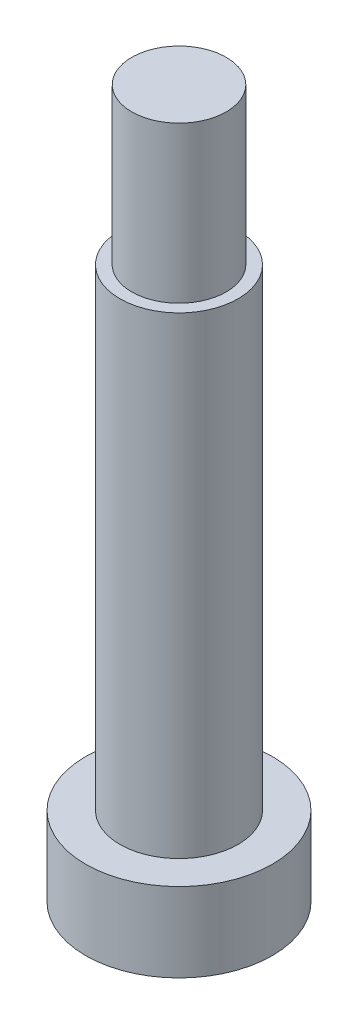
ISO-10303-21;
HEADER;
FILE_DESCRIPTION(('STEP AP214'),'2;1');
FILE_NAME('part.step','',(''),(''),'','','');
FILE_SCHEMA(('AUTOMOTIVE_DESIGN { 1 0 10303 214 1 1 1 1 }'));
ENDSEC;
DATA;
#1=APPLICATION_CONTEXT('core data for automotive mechanical design processes');
#2=APPLICATION_PROTOCOL_DEFINITION('international standard','automotive_design',2000,#1);
#3=PRODUCT_CONTEXT('',#1,'mechanical');
#4=PRODUCT('Part','Part','',(#3));
#5=PRODUCT_RELATED_PRODUCT_CATEGORY('part','',(#4));
#6=PRODUCT_DEFINITION_FORMATION('','',#4);
#7=PRODUCT_DEFINITION_CONTEXT('part definition',#1,'design');
#8=PRODUCT_DEFINITION('design','',#6,#7);
#9=PRODUCT_DEFINITION_SHAPE('','',#8);
#10=(LENGTH_UNIT() NAMED_UNIT(*) SI_UNIT(.MILLI.,.METRE.));
#11=(NAMED_UNIT(*) PLANE_ANGLE_UNIT() SI_UNIT($,.RADIAN.));
#12=(NAMED_UNIT(*) SI_UNIT($,.STERADIAN.) SOLID_ANGLE_UNIT());
#13=UNCERTAINTY_MEASURE_WITH_UNIT(LENGTH_MEASURE(1.E-05),#10,'distance_accuracy_value','');
#14=(GEOMETRIC_REPRESENTATION_CONTEXT(3) GLOBAL_UNCERTAINTY_ASSIGNED_CONTEXT((#13)) GLOBAL_UNIT_ASSIGNED_CONTEXT((#10,
#11,#12)) REPRESENTATION_CONTEXT('',''));
#15=CARTESIAN_POINT('',(0.,0.,0.));
#16=DIRECTION('',(0.,0.,1.));
#17=DIRECTION('',(1.,0.,0.));
#18=AXIS2_PLACEMENT_3D('',#15,#16,#17);
#19=CARTESIAN_POINT('',(0.,59.9,0.));
#20=DIRECTION('',(0.,-1.,0.));
#21=DIRECTION('',(0.,0.,-1.));
#22=AXIS2_PLACEMENT_3D('',#19,#20,#21);
#23=CYLINDRICAL_SURFACE('',#22,4.);
#24=CARTESIAN_POINT('',(0.,46.7,0.));
#25=DIRECTION('',(0.,1.,0.));
#26=DIRECTION('',(0.,0.,1.));
#27=AXIS2_PLACEMENT_3D('',#24,#25,#26);
#28=CIRCLE('',#27,4.);
#29=CARTESIAN_POINT('',(0.,46.7,4.));
#30=VERTEX_POINT('',#29);
#31=EDGE_CURVE('E189',#30,#30,#28,.T.);
#32=ORIENTED_EDGE('',*,*,#31,.T.);
#33=EDGE_LOOP('',(#32));
#34=FACE_BOUND('',#33,.T.);
#35=CARTESIAN_POINT('',(0.,59.9,0.));
#36=DIRECTION('',(0.,1.,0.));
#37=DIRECTION('',(0.,0.,1.));
#38=AXIS2_PLACEMENT_3D('',#35,#36,#37);
#39=CIRCLE('',#38,4.);
#40=CARTESIAN_POINT('',(0.,59.9,4.));
#41=VERTEX_POINT('',#40);
#42=EDGE_CURVE('E12',#41,#41,#39,.T.);
#43=ORIENTED_EDGE('',*,*,#42,.F.);
#44=EDGE_LOOP('',(#43));
#45=FACE_BOUND('',#44,.T.);
#46=ADVANCED_FACE('F73',(#34,#45),#23,.T.);
#47=CARTESIAN_POINT('',(0.,59.9,0.));
#48=DIRECTION('',(0.,1.,0.));
#49=DIRECTION('',(0.,0.,1.));
#50=AXIS2_PLACEMENT_3D('',#47,#48,#49);
#51=PLANE('',#50);
#52=ORIENTED_EDGE('',*,*,#42,.T.);
#53=EDGE_LOOP('',(#52));
#54=FACE_BOUND('',#53,.T.);
#55=ADVANCED_FACE('F197',(#54),#51,.T.);
#56=CARTESIAN_POINT('',(0.,46.7,0.));
#57=DIRECTION('',(0.,-1.,0.));
#58=DIRECTION('',(0.,0.,-1.));
#59=AXIS2_PLACEMENT_3D('',#56,#57,#58);
#60=CYLINDRICAL_SURFACE('',#59,5.);
#61=CARTESIAN_POINT('',(0.,6.7,0.));
#62=DIRECTION('',(0.,1.,0.));
#63=DIRECTION('',(0.,0.,1.));
#64=AXIS2_PLACEMENT_3D('',#61,#62,#63);
#65=CIRCLE('',#64,5.);
#66=CARTESIAN_POINT('',(0.,6.7,5.));
#67=VERTEX_POINT('',#66);
#68=EDGE_CURVE('E185',#67,#67,#65,.T.);
#69=ORIENTED_EDGE('',*,*,#68,.T.);
#70=EDGE_LOOP('',(#69));
#71=FACE_BOUND('',#70,.T.);
#72=CARTESIAN_POINT('',(0.,46.7,0.));
#73=DIRECTION('',(0.,1.,0.));
#74=DIRECTION('',(0.,0.,1.));
#75=AXIS2_PLACEMENT_3D('',#72,#73,#74);
#76=CIRCLE('',#75,5.);
#77=CARTESIAN_POINT('',(0.,46.7,5.));
#78=VERTEX_POINT('',#77);
#79=EDGE_CURVE('E81',#78,#78,#76,.T.);
#80=ORIENTED_EDGE('',*,*,#79,.F.);
#81=EDGE_LOOP('',(#80));
#82=FACE_BOUND('',#81,.T.);
#83=ADVANCED_FACE('F200',(#71,#82),#60,.T.);
#84=CARTESIAN_POINT('',(0.,46.7,0.));
#85=DIRECTION('',(0.,1.,0.));
#86=DIRECTION('',(0.,0.,1.));
#87=AXIS2_PLACEMENT_3D('',#84,#85,#86);
#88=PLANE('',#87);
#89=ORIENTED_EDGE('',*,*,#31,.F.);
#90=EDGE_LOOP('',(#89));
#91=FACE_BOUND('',#90,.T.);
#92=ORIENTED_EDGE('',*,*,#79,.T.);
#93=EDGE_LOOP('',(#92));
#94=FACE_BOUND('',#93,.T.);
#95=ADVANCED_FACE('F192',(#91,#94),#88,.T.);
#96=CARTESIAN_POINT('',(0.,6.7,0.));
#97=DIRECTION('',(0.,-1.,0.));
#98=DIRECTION('',(0.,0.,-1.));
#99=AXIS2_PLACEMENT_3D('',#96,#97,#98);
#100=CYLINDRICAL_SURFACE('',#99,7.9);
#101=CARTESIAN_POINT('',(0.,6.7,0.));
#102=DIRECTION('',(0.,1.,0.));
#103=DIRECTION('',(0.,0.,1.));
#104=AXIS2_PLACEMENT_3D('',#101,#102,#103);
#105=CIRCLE('',#104,7.9);
#106=CARTESIAN_POINT('',(0.,6.7,7.9));
#107=VERTEX_POINT('',#106);
#108=EDGE_CURVE('E184',#107,#107,#105,.T.);
#109=ORIENTED_EDGE('',*,*,#108,.F.);
#110=EDGE_LOOP('',(#109));
#111=FACE_BOUND('',#110,.T.);
#112=CARTESIAN_POINT('',(0.,0.,0.));
#113=DIRECTION('',(0.,1.,0.));
#114=DIRECTION('',(0.,0.,1.));
#115=AXIS2_PLACEMENT_3D('',#112,#113,#114);
#116=CIRCLE('',#115,7.9);
#117=CARTESIAN_POINT('',(0.,0.,7.9));
#118=VERTEX_POINT('',#117);
#119=EDGE_CURVE('E176',#118,#118,#116,.T.);
#120=ORIENTED_EDGE('',*,*,#119,.T.);
#121=EDGE_LOOP('',(#120));
#122=FACE_BOUND('',#121,.T.);
#123=ADVANCED_FACE('F207',(#111,#122),#100,.T.);
#124=CARTESIAN_POINT('',(0.,6.7,0.));
#125=DIRECTION('',(0.,1.,0.));
#126=DIRECTION('',(0.,0.,1.));
#127=AXIS2_PLACEMENT_3D('',#124,#125,#126);
#128=PLANE('',#127);
#129=ORIENTED_EDGE('',*,*,#68,.F.);
#130=EDGE_LOOP('',(#129));
#131=FACE_BOUND('',#130,.T.);
#132=ORIENTED_EDGE('',*,*,#108,.T.);
#133=EDGE_LOOP('',(#132));
#134=FACE_BOUND('',#133,.T.);
#135=ADVANCED_FACE('F243',(#131,#134),#128,.T.);
#136=CARTESIAN_POINT('',(0.,0.,0.));
#137=DIRECTION('',(0.,1.,0.));
#138=DIRECTION('',(0.,0.,1.));
#139=AXIS2_PLACEMENT_3D('',#136,#137,#138);
#140=PLANE('',#139);
#141=DIRECTION('',(-0.866025403784439,0.,0.5));
#142=VECTOR('',#141,1.);
#143=CARTESIAN_POINT('',(2.5,0.,1.44337567297406));
#144=LINE('',#143,#142);
#145=CARTESIAN_POINT('',(2.5,0.,1.44337567297406));
#146=VERTEX_POINT('',#145);
#147=CARTESIAN_POINT('',(0.,0.,2.88675134594813));
#148=VERTEX_POINT('',#147);
#149=EDGE_CURVE('E161',#146,#148,#144,.T.);
#150=ORIENTED_EDGE('',*,*,#149,.F.);
#151=DIRECTION('',(0.,0.,1.));
#152=VECTOR('',#151,1.);
#153=CARTESIAN_POINT('',(2.5,0.,-1.44337567297406));
#154=LINE('',#153,#152);
#155=CARTESIAN_POINT('',(2.5,0.,-1.44337567297406));
#156=VERTEX_POINT('',#155);
#157=EDGE_CURVE('E87',#156,#146,#154,.T.);
#158=ORIENTED_EDGE('',*,*,#157,.F.);
#159=DIRECTION('',(0.866025403784439,0.,0.5));
#160=VECTOR('',#159,1.);
#161=CARTESIAN_POINT('',(0.,0.,-2.88675134594813));
#162=LINE('',#161,#160);
#163=CARTESIAN_POINT('',(0.,0.,-2.88675134594813));
#164=VERTEX_POINT('',#163);
#165=EDGE_CURVE('E175',#164,#156,#162,.T.);
#166=ORIENTED_EDGE('',*,*,#165,.F.);
#167=DIRECTION('',(0.866025403784439,0.,-0.5));
#168=VECTOR('',#167,1.);
#169=CARTESIAN_POINT('',(-2.5,0.,-1.44337567297407));
#170=LINE('',#169,#168);
#171=CARTESIAN_POINT('',(-2.5,0.,-1.44337567297407));
#172=VERTEX_POINT('',#171);
#173=EDGE_CURVE('E167',#172,#164,#170,.T.);
#174=ORIENTED_EDGE('',*,*,#173,.F.);
#175=DIRECTION('',(0.,0.,-1.));
#176=VECTOR('',#175,1.);
#177=CARTESIAN_POINT('',(-2.5,0.,1.44337567297406));
#178=LINE('',#177,#176);
#179=CARTESIAN_POINT('',(-2.5,0.,1.44337567297406));
#180=VERTEX_POINT('',#179);
#181=EDGE_CURVE('E140',#180,#172,#178,.T.);
#182=ORIENTED_EDGE('',*,*,#181,.F.);
#183=DIRECTION('',(-0.866025403784439,0.,-0.5));
#184=VECTOR('',#183,1.);
#185=CARTESIAN_POINT('',(0.,0.,2.88675134594813));
#186=LINE('',#185,#184);
#187=EDGE_CURVE('E168',#148,#180,#186,.T.);
#188=ORIENTED_EDGE('',*,*,#187,.F.);
#189=EDGE_LOOP('',(#150,#158,#166,#174,#182,#188));
#190=FACE_BOUND('',#189,.T.);
#191=ORIENTED_EDGE('',*,*,#119,.F.);
#192=EDGE_LOOP('',(#191));
#193=FACE_BOUND('',#192,.T.);
#194=ADVANCED_FACE('F236',(#190,#193),#140,.F.);
#195=CARTESIAN_POINT('',(2.5,3.,-1.44337567297406));
#196=DIRECTION('',(1.,0.,0.));
#197=DIRECTION('',(0.,0.,-1.));
#198=AXIS2_PLACEMENT_3D('',#195,#196,#197);
#199=PLANE('',#198);
#200=ORIENTED_EDGE('',*,*,#157,.T.);
#201=DIRECTION('',(0.,-1.,0.));
#202=VECTOR('',#201,1.);
#203=CARTESIAN_POINT('',(2.5,3.,1.44337567297406));
#204=LINE('',#203,#202);
#205=CARTESIAN_POINT('',(2.5,3.,1.44337567297406));
#206=VERTEX_POINT('',#205);
#207=EDGE_CURVE('E118',#206,#146,#204,.T.);
#208=ORIENTED_EDGE('',*,*,#207,.F.);
#209=DIRECTION('',(0.,0.,1.));
#210=VECTOR('',#209,1.);
#211=CARTESIAN_POINT('',(2.5,3.,-1.44337567297406));
#212=LINE('',#211,#210);
#213=CARTESIAN_POINT('',(2.5,3.,-1.44337567297406));
#214=VERTEX_POINT('',#213);
#215=EDGE_CURVE('E172',#214,#206,#212,.T.);
#216=ORIENTED_EDGE('',*,*,#215,.F.);
#217=DIRECTION('',(0.,-1.,0.));
#218=VECTOR('',#217,1.);
#219=CARTESIAN_POINT('',(2.5,3.,-1.44337567297406));
#220=LINE('',#219,#218);
#221=EDGE_CURVE('E97',#214,#156,#220,.T.);
#222=ORIENTED_EDGE('',*,*,#221,.T.);
#223=EDGE_LOOP('',(#200,#208,#216,#222));
#224=FACE_BOUND('',#223,.T.);
#225=ADVANCED_FACE('F245',(#224),#199,.F.);
#226=CARTESIAN_POINT('',(0.,3.,-2.88675134594813));
#227=DIRECTION('',(0.5,0.,-0.866025403784439));
#228=DIRECTION('',(-0.866025403784439,0.,-0.5));
#229=AXIS2_PLACEMENT_3D('',#226,#227,#228);
#230=PLANE('',#229);
#231=ORIENTED_EDGE('',*,*,#165,.T.);
#232=ORIENTED_EDGE('',*,*,#221,.F.);
#233=DIRECTION('',(0.866025403784439,0.,0.5));
#234=VECTOR('',#233,1.);
#235=CARTESIAN_POINT('',(0.,3.,-2.88675134594813));
#236=LINE('',#235,#234);
#237=CARTESIAN_POINT('',(0.,3.,-2.88675134594813));
#238=VERTEX_POINT('',#237);
#239=EDGE_CURVE('E148',#238,#214,#236,.T.);
#240=ORIENTED_EDGE('',*,*,#239,.F.);
#241=DIRECTION('',(0.,-1.,0.));
#242=VECTOR('',#241,1.);
#243=CARTESIAN_POINT('',(0.,3.,-2.88675134594813));
#244=LINE('',#243,#242);
#245=EDGE_CURVE('E142',#238,#164,#244,.T.);
#246=ORIENTED_EDGE('',*,*,#245,.T.);
#247=EDGE_LOOP('',(#231,#232,#240,#246));
#248=FACE_BOUND('',#247,.T.);
#249=ADVANCED_FACE('F272',(#248),#230,.F.);
#250=CARTESIAN_POINT('',(-2.5,3.,-1.44337567297407));
#251=DIRECTION('',(-0.5,0.,-0.866025403784439));
#252=DIRECTION('',(-0.866025403784439,0.,0.5));
#253=AXIS2_PLACEMENT_3D('',#250,#251,#252);
#254=PLANE('',#253);
#255=ORIENTED_EDGE('',*,*,#173,.T.);
#256=ORIENTED_EDGE('',*,*,#245,.F.);
#257=DIRECTION('',(0.866025403784439,0.,-0.5));
#258=VECTOR('',#257,1.);
#259=CARTESIAN_POINT('',(-2.5,3.,-1.44337567297407));
#260=LINE('',#259,#258);
#261=CARTESIAN_POINT('',(-2.5,3.,-1.44337567297407));
#262=VERTEX_POINT('',#261);
#263=EDGE_CURVE('E143',#262,#238,#260,.T.);
#264=ORIENTED_EDGE('',*,*,#263,.F.);
#265=DIRECTION('',(0.,-1.,0.));
#266=VECTOR('',#265,1.);
#267=CARTESIAN_POINT('',(-2.5,3.,-1.44337567297407));
#268=LINE('',#267,#266);
#269=EDGE_CURVE('E127',#262,#172,#268,.T.);
#270=ORIENTED_EDGE('',*,*,#269,.T.);
#271=EDGE_LOOP('',(#255,#256,#264,#270));
#272=FACE_BOUND('',#271,.T.);
#273=ADVANCED_FACE('F149',(#272),#254,.F.);
#274=CARTESIAN_POINT('',(-2.5,3.,1.44337567297406));
#275=DIRECTION('',(-1.,0.,0.));
#276=DIRECTION('',(0.,0.,1.));
#277=AXIS2_PLACEMENT_3D('',#274,#275,#276);
#278=PLANE('',#277);
#279=ORIENTED_EDGE('',*,*,#181,.T.);
#280=ORIENTED_EDGE('',*,*,#269,.F.);
#281=DIRECTION('',(0.,0.,-1.));
#282=VECTOR('',#281,1.);
#283=CARTESIAN_POINT('',(-2.5,3.,1.44337567297406));
#284=LINE('',#283,#282);
#285=CARTESIAN_POINT('',(-2.5,3.,1.44337567297406));
#286=VERTEX_POINT('',#285);
#287=EDGE_CURVE('E132',#286,#262,#284,.T.);
#288=ORIENTED_EDGE('',*,*,#287,.F.);
#289=DIRECTION('',(0.,-1.,0.));
#290=VECTOR('',#289,1.);
#291=CARTESIAN_POINT('',(-2.5,3.,1.44337567297406));
#292=LINE('',#291,#290);
#293=EDGE_CURVE('E145',#286,#180,#292,.T.);
#294=ORIENTED_EDGE('',*,*,#293,.T.);
#295=EDGE_LOOP('',(#279,#280,#288,#294));
#296=FACE_BOUND('',#295,.T.);
#297=ADVANCED_FACE('F135',(#296),#278,.F.);
#298=CARTESIAN_POINT('',(0.,3.,2.88675134594813));
#299=DIRECTION('',(-0.5,0.,0.866025403784438));
#300=DIRECTION('',(0.866025403784439,0.,0.5));
#301=AXIS2_PLACEMENT_3D('',#298,#299,#300);
#302=PLANE('',#301);
#303=ORIENTED_EDGE('',*,*,#187,.T.);
#304=ORIENTED_EDGE('',*,*,#293,.F.);
#305=DIRECTION('',(-0.866025403784439,0.,-0.5));
#306=VECTOR('',#305,1.);
#307=CARTESIAN_POINT('',(0.,3.,2.88675134594813));
#308=LINE('',#307,#306);
#309=CARTESIAN_POINT('',(0.,3.,2.88675134594813));
#310=VERTEX_POINT('',#309);
#311=EDGE_CURVE('E154',#310,#286,#308,.T.);
#312=ORIENTED_EDGE('',*,*,#311,.F.);
#313=DIRECTION('',(0.,-1.,0.));
#314=VECTOR('',#313,1.);
#315=CARTESIAN_POINT('',(0.,3.,2.88675134594813));
#316=LINE('',#315,#314);
#317=EDGE_CURVE('E177',#310,#148,#316,.T.);
#318=ORIENTED_EDGE('',*,*,#317,.T.);
#319=EDGE_LOOP('',(#303,#304,#312,#318));
#320=FACE_BOUND('',#319,.T.);
#321=ADVANCED_FACE('F292',(#320),#302,.F.);
#322=CARTESIAN_POINT('',(2.5,3.,1.44337567297406));
#323=DIRECTION('',(0.5,0.,0.866025403784438));
#324=DIRECTION('',(0.866025403784439,0.,-0.5));
#325=AXIS2_PLACEMENT_3D('',#322,#323,#324);
#326=PLANE('',#325);
#327=ORIENTED_EDGE('',*,*,#149,.T.);
#328=ORIENTED_EDGE('',*,*,#317,.F.);
#329=DIRECTION('',(-0.866025403784439,0.,0.5));
#330=VECTOR('',#329,1.);
#331=CARTESIAN_POINT('',(2.5,3.,1.44337567297406));
#332=LINE('',#331,#330);
#333=EDGE_CURVE('E160',#206,#310,#332,.T.);
#334=ORIENTED_EDGE('',*,*,#333,.F.);
#335=ORIENTED_EDGE('',*,*,#207,.T.);
#336=EDGE_LOOP('',(#327,#328,#334,#335));
#337=FACE_BOUND('',#336,.T.);
#338=ADVANCED_FACE('F297',(#337),#326,.F.);
#339=CARTESIAN_POINT('',(0.,3.,0.));
#340=DIRECTION('',(0.,-1.,0.));
#341=DIRECTION('',(0.,0.,-1.));
#342=AXIS2_PLACEMENT_3D('',#339,#340,#341);
#343=PLANE('',#342);
#344=ORIENTED_EDGE('',*,*,#215,.T.);
#345=ORIENTED_EDGE('',*,*,#333,.T.);
#346=ORIENTED_EDGE('',*,*,#311,.T.);
#347=ORIENTED_EDGE('',*,*,#287,.T.);
#348=ORIENTED_EDGE('',*,*,#263,.T.);
#349=ORIENTED_EDGE('',*,*,#239,.T.);
#350=EDGE_LOOP('',(#344,#345,#346,#347,#348,#349));
#351=FACE_BOUND('',#350,.T.);
#352=ADVANCED_FACE('F155',(#351),#343,.T.);
#353=CLOSED_SHELL('',(#46,#55,#83,#95,#123,#135,#194,#225,#249,#273,#297,#321,#338,#352));
#354=MANIFOLD_SOLID_BREP('B2',#353);
#355=ADVANCED_BREP_SHAPE_REPRESENTATION('',(#18,#354),#14);
#356=SHAPE_DEFINITION_REPRESENTATION(#9,#355);
ENDSEC;
END-ISO-10303-21;
